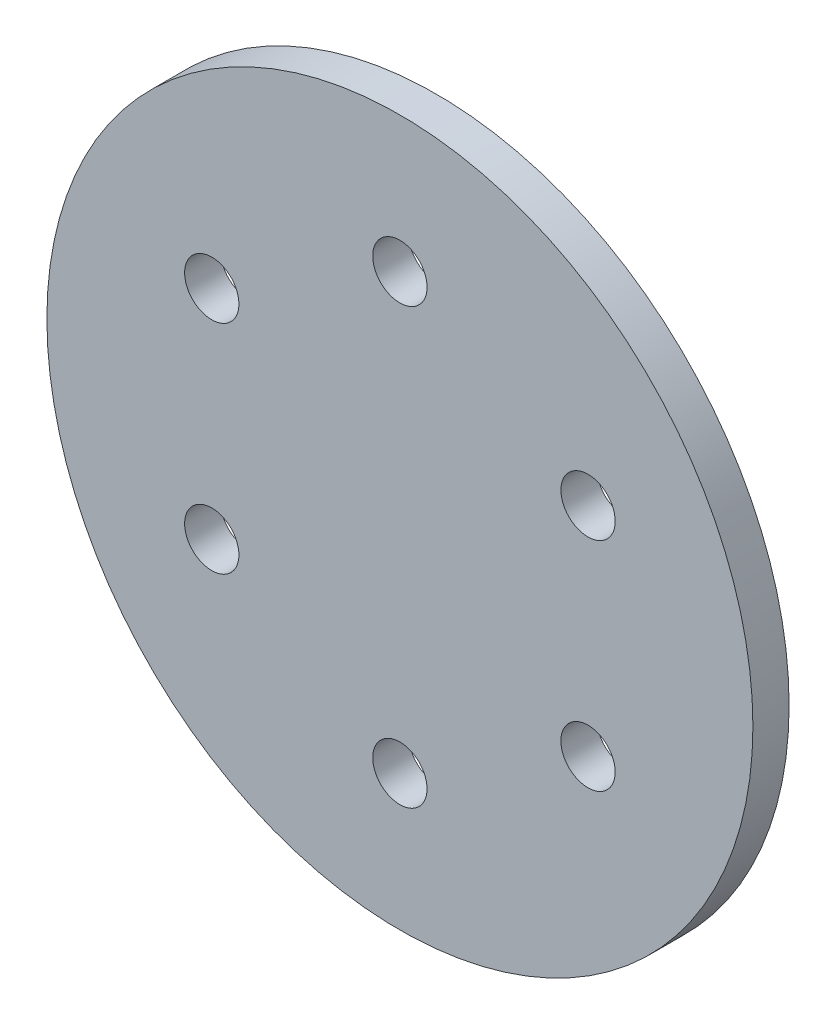
ISO-10303-21;
HEADER;
FILE_DESCRIPTION(('STEP AP214'),'2;1');
FILE_NAME('part.step','',(''),(''),'','','');
FILE_SCHEMA(('AUTOMOTIVE_DESIGN { 1 0 10303 214 1 1 1 1 }'));
ENDSEC;
DATA;
#1=APPLICATION_CONTEXT('core data for automotive mechanical design processes');
#2=APPLICATION_PROTOCOL_DEFINITION('international standard','automotive_design',2000,#1);
#3=PRODUCT_CONTEXT('',#1,'mechanical');
#4=PRODUCT('Part','Part','',(#3));
#5=PRODUCT_RELATED_PRODUCT_CATEGORY('part','',(#4));
#6=PRODUCT_DEFINITION_FORMATION('','',#4);
#7=PRODUCT_DEFINITION_CONTEXT('part definition',#1,'design');
#8=PRODUCT_DEFINITION('design','',#6,#7);
#9=PRODUCT_DEFINITION_SHAPE('','',#8);
#10=(LENGTH_UNIT() NAMED_UNIT(*) SI_UNIT(.MILLI.,.METRE.));
#11=(NAMED_UNIT(*) PLANE_ANGLE_UNIT() SI_UNIT($,.RADIAN.));
#12=(NAMED_UNIT(*) SI_UNIT($,.STERADIAN.) SOLID_ANGLE_UNIT());
#13=UNCERTAINTY_MEASURE_WITH_UNIT(LENGTH_MEASURE(1.E-05),#10,'distance_accuracy_value','');
#14=(GEOMETRIC_REPRESENTATION_CONTEXT(3) GLOBAL_UNCERTAINTY_ASSIGNED_CONTEXT((#13)) GLOBAL_UNIT_ASSIGNED_CONTEXT((#10,
#11,#12)) REPRESENTATION_CONTEXT('',''));
#15=CARTESIAN_POINT('',(0.,0.,0.));
#16=DIRECTION('',(0.,0.,1.));
#17=DIRECTION('',(1.,0.,0.));
#18=AXIS2_PLACEMENT_3D('',#15,#16,#17);
#19=CARTESIAN_POINT('',(0.,0.,3.175));
#20=DIRECTION('',(0.,0.,1.));
#21=DIRECTION('',(1.,0.,0.));
#22=AXIS2_PLACEMENT_3D('',#19,#20,#21);
#23=PLANE('',#22);
#24=CARTESIAN_POINT('',(-16.4977839420919,-9.52500000000094,3.175));
#25=DIRECTION('',(0.,0.,1.));
#26=DIRECTION('',(1.,0.,0.));
#27=AXIS2_PLACEMENT_3D('',#24,#25,#26);
#28=CIRCLE('',#27,2.381250000002);
#29=CARTESIAN_POINT('',(-14.1165339420899,-9.52500000000094,3.175));
#30=VERTEX_POINT('',#29);
#31=EDGE_CURVE('E65',#30,#30,#28,.T.);
#32=ORIENTED_EDGE('',*,*,#31,.F.);
#33=EDGE_LOOP('',(#32));
#34=FACE_BOUND('',#33,.T.);
#35=CARTESIAN_POINT('',(16.4977839420952,-9.52499999999906,3.175));
#36=DIRECTION('',(0.,0.,1.));
#37=DIRECTION('',(1.,0.,0.));
#38=AXIS2_PLACEMENT_3D('',#35,#36,#37);
#39=CIRCLE('',#38,2.38125000000136);
#40=CARTESIAN_POINT('',(18.8790339420965,-9.52499999999906,3.175));
#41=VERTEX_POINT('',#40);
#42=EDGE_CURVE('E53',#41,#41,#39,.T.);
#43=ORIENTED_EDGE('',*,*,#42,.F.);
#44=EDGE_LOOP('',(#43));
#45=FACE_BOUND('',#44,.T.);
#46=CARTESIAN_POINT('',(0.,19.05,3.175));
#47=DIRECTION('',(0.,0.,1.));
#48=DIRECTION('',(1.,0.,0.));
#49=AXIS2_PLACEMENT_3D('',#46,#47,#48);
#50=CIRCLE('',#49,2.38125);
#51=CARTESIAN_POINT('',(2.38125,19.05,3.175));
#52=VERTEX_POINT('',#51);
#53=EDGE_CURVE('E42',#52,#52,#50,.T.);
#54=ORIENTED_EDGE('',*,*,#53,.F.);
#55=EDGE_LOOP('',(#54));
#56=FACE_BOUND('',#55,.T.);
#57=CARTESIAN_POINT('',(0.,0.,3.175));
#58=DIRECTION('',(0.,0.,1.));
#59=DIRECTION('',(1.,0.,0.));
#60=AXIS2_PLACEMENT_3D('',#57,#58,#59);
#61=CIRCLE('',#60,30.95625);
#62=CARTESIAN_POINT('',(30.95625,0.,3.175));
#63=VERTEX_POINT('',#62);
#64=EDGE_CURVE('E10',#63,#63,#61,.T.);
#65=ORIENTED_EDGE('',*,*,#64,.T.);
#66=EDGE_LOOP('',(#65));
#67=FACE_BOUND('',#66,.T.);
#68=CARTESIAN_POINT('',(16.4977839420941,9.52500000000094,3.175));
#69=DIRECTION('',(0.,0.,1.));
#70=DIRECTION('',(1.,0.,0.));
#71=AXIS2_PLACEMENT_3D('',#68,#69,#70);
#72=CIRCLE('',#71,2.38125000000029);
#73=CARTESIAN_POINT('',(18.8790339420944,9.52500000000094,3.175));
#74=VERTEX_POINT('',#73);
#75=EDGE_CURVE('E47',#74,#74,#72,.T.);
#76=ORIENTED_EDGE('',*,*,#75,.F.);
#77=EDGE_LOOP('',(#76));
#78=FACE_BOUND('',#77,.T.);
#79=CARTESIAN_POINT('',(2.16106835429203E-12,-19.05,3.175));
#80=DIRECTION('',(0.,0.,1.));
#81=DIRECTION('',(1.,0.,0.));
#82=AXIS2_PLACEMENT_3D('',#79,#80,#81);
#83=CIRCLE('',#82,2.38125000000219);
#84=CARTESIAN_POINT('',(2.38125000000436,-19.05,3.175));
#85=VERTEX_POINT('',#84);
#86=EDGE_CURVE('E59',#85,#85,#83,.T.);
#87=ORIENTED_EDGE('',*,*,#86,.F.);
#88=EDGE_LOOP('',(#87));
#89=FACE_BOUND('',#88,.T.);
#90=CARTESIAN_POINT('',(-16.497783942093,9.52499999999905,3.175));
#91=DIRECTION('',(0.,0.,1.));
#92=DIRECTION('',(1.,0.,0.));
#93=AXIS2_PLACEMENT_3D('',#90,#91,#92);
#94=CIRCLE('',#93,2.38125000000102);
#95=CARTESIAN_POINT('',(-14.116533942092,9.52499999999905,3.175));
#96=VERTEX_POINT('',#95);
#97=EDGE_CURVE('E71',#96,#96,#94,.T.);
#98=ORIENTED_EDGE('',*,*,#97,.F.);
#99=EDGE_LOOP('',(#98));
#100=FACE_BOUND('',#99,.T.);
#101=ADVANCED_FACE('F31',(#34,#45,#56,#67,#78,#89,#100),#23,.T.);
#102=CARTESIAN_POINT('',(0.,0.,0.));
#103=DIRECTION('',(0.,0.,1.));
#104=DIRECTION('',(1.,0.,0.));
#105=AXIS2_PLACEMENT_3D('',#102,#103,#104);
#106=PLANE('',#105);
#107=CARTESIAN_POINT('',(0.,0.,0.));
#108=DIRECTION('',(0.,0.,1.));
#109=DIRECTION('',(1.,0.,0.));
#110=AXIS2_PLACEMENT_3D('',#107,#108,#109);
#111=CIRCLE('',#110,30.95625);
#112=CARTESIAN_POINT('',(30.95625,0.,0.));
#113=VERTEX_POINT('',#112);
#114=EDGE_CURVE('E35',#113,#113,#111,.T.);
#115=ORIENTED_EDGE('',*,*,#114,.F.);
#116=EDGE_LOOP('',(#115));
#117=FACE_BOUND('',#116,.T.);
#118=CARTESIAN_POINT('',(0.,19.05,0.));
#119=DIRECTION('',(0.,0.,1.));
#120=DIRECTION('',(1.,0.,0.));
#121=AXIS2_PLACEMENT_3D('',#118,#119,#120);
#122=CIRCLE('',#121,2.38125);
#123=CARTESIAN_POINT('',(2.38125,19.05,0.));
#124=VERTEX_POINT('',#123);
#125=EDGE_CURVE('E44',#124,#124,#122,.T.);
#126=ORIENTED_EDGE('',*,*,#125,.T.);
#127=EDGE_LOOP('',(#126));
#128=FACE_BOUND('',#127,.T.);
#129=CARTESIAN_POINT('',(16.4977839420941,9.52500000000094,0.));
#130=DIRECTION('',(0.,0.,1.));
#131=DIRECTION('',(1.,0.,0.));
#132=AXIS2_PLACEMENT_3D('',#129,#130,#131);
#133=CIRCLE('',#132,2.38125000000029);
#134=CARTESIAN_POINT('',(18.8790339420944,9.52500000000094,0.));
#135=VERTEX_POINT('',#134);
#136=EDGE_CURVE('E50',#135,#135,#133,.T.);
#137=ORIENTED_EDGE('',*,*,#136,.T.);
#138=EDGE_LOOP('',(#137));
#139=FACE_BOUND('',#138,.T.);
#140=CARTESIAN_POINT('',(16.4977839420952,-9.52499999999906,0.));
#141=DIRECTION('',(0.,0.,1.));
#142=DIRECTION('',(1.,0.,0.));
#143=AXIS2_PLACEMENT_3D('',#140,#141,#142);
#144=CIRCLE('',#143,2.38125000000136);
#145=CARTESIAN_POINT('',(18.8790339420965,-9.52499999999906,0.));
#146=VERTEX_POINT('',#145);
#147=EDGE_CURVE('E56',#146,#146,#144,.T.);
#148=ORIENTED_EDGE('',*,*,#147,.T.);
#149=EDGE_LOOP('',(#148));
#150=FACE_BOUND('',#149,.T.);
#151=CARTESIAN_POINT('',(2.16106835429203E-12,-19.05,0.));
#152=DIRECTION('',(0.,0.,1.));
#153=DIRECTION('',(1.,0.,0.));
#154=AXIS2_PLACEMENT_3D('',#151,#152,#153);
#155=CIRCLE('',#154,2.38125000000219);
#156=CARTESIAN_POINT('',(2.38125000000436,-19.05,0.));
#157=VERTEX_POINT('',#156);
#158=EDGE_CURVE('E62',#157,#157,#155,.T.);
#159=ORIENTED_EDGE('',*,*,#158,.T.);
#160=EDGE_LOOP('',(#159));
#161=FACE_BOUND('',#160,.T.);
#162=CARTESIAN_POINT('',(-16.4977839420919,-9.52500000000094,0.));
#163=DIRECTION('',(0.,0.,1.));
#164=DIRECTION('',(1.,0.,0.));
#165=AXIS2_PLACEMENT_3D('',#162,#163,#164);
#166=CIRCLE('',#165,2.381250000002);
#167=CARTESIAN_POINT('',(-14.1165339420899,-9.52500000000094,0.));
#168=VERTEX_POINT('',#167);
#169=EDGE_CURVE('E68',#168,#168,#166,.T.);
#170=ORIENTED_EDGE('',*,*,#169,.T.);
#171=EDGE_LOOP('',(#170));
#172=FACE_BOUND('',#171,.T.);
#173=CARTESIAN_POINT('',(-16.497783942093,9.52499999999905,0.));
#174=DIRECTION('',(0.,0.,1.));
#175=DIRECTION('',(1.,0.,0.));
#176=AXIS2_PLACEMENT_3D('',#173,#174,#175);
#177=CIRCLE('',#176,2.38125000000102);
#178=CARTESIAN_POINT('',(-14.116533942092,9.52499999999905,0.));
#179=VERTEX_POINT('',#178);
#180=EDGE_CURVE('E74',#179,#179,#177,.T.);
#181=ORIENTED_EDGE('',*,*,#180,.T.);
#182=EDGE_LOOP('',(#181));
#183=FACE_BOUND('',#182,.T.);
#184=ADVANCED_FACE('F84',(#117,#128,#139,#150,#161,#172,#183),#106,.F.);
#185=CARTESIAN_POINT('',(0.,0.,3.175));
#186=DIRECTION('',(0.,0.,-1.));
#187=DIRECTION('',(-1.,0.,0.));
#188=AXIS2_PLACEMENT_3D('',#185,#186,#187);
#189=CYLINDRICAL_SURFACE('',#188,30.95625);
#190=ORIENTED_EDGE('',*,*,#64,.F.);
#191=EDGE_LOOP('',(#190));
#192=FACE_BOUND('',#191,.T.);
#193=ORIENTED_EDGE('',*,*,#114,.T.);
#194=EDGE_LOOP('',(#193));
#195=FACE_BOUND('',#194,.T.);
#196=ADVANCED_FACE('F33',(#192,#195),#189,.T.);
#197=CARTESIAN_POINT('',(0.,19.05,3.175));
#198=DIRECTION('',(0.,0.,-1.));
#199=DIRECTION('',(-1.,0.,0.));
#200=AXIS2_PLACEMENT_3D('',#197,#198,#199);
#201=CYLINDRICAL_SURFACE('',#200,2.38125);
#202=ORIENTED_EDGE('',*,*,#53,.T.);
#203=EDGE_LOOP('',(#202));
#204=FACE_BOUND('',#203,.T.);
#205=ORIENTED_EDGE('',*,*,#125,.F.);
#206=EDGE_LOOP('',(#205));
#207=FACE_BOUND('',#206,.T.);
#208=ADVANCED_FACE('F94',(#204,#207),#201,.F.);
#209=CARTESIAN_POINT('',(16.4977839420941,9.52500000000094,3.175));
#210=DIRECTION('',(0.,0.,-1.));
#211=DIRECTION('',(-1.,0.,0.));
#212=AXIS2_PLACEMENT_3D('',#209,#210,#211);
#213=CYLINDRICAL_SURFACE('',#212,2.38125000000029);
#214=ORIENTED_EDGE('',*,*,#75,.T.);
#215=EDGE_LOOP('',(#214));
#216=FACE_BOUND('',#215,.T.);
#217=ORIENTED_EDGE('',*,*,#136,.F.);
#218=EDGE_LOOP('',(#217));
#219=FACE_BOUND('',#218,.T.);
#220=ADVANCED_FACE('F97',(#216,#219),#213,.F.);
#221=CARTESIAN_POINT('',(16.4977839420952,-9.52499999999906,3.175));
#222=DIRECTION('',(0.,0.,-1.));
#223=DIRECTION('',(-1.,0.,0.));
#224=AXIS2_PLACEMENT_3D('',#221,#222,#223);
#225=CYLINDRICAL_SURFACE('',#224,2.38125000000136);
#226=ORIENTED_EDGE('',*,*,#42,.T.);
#227=EDGE_LOOP('',(#226));
#228=FACE_BOUND('',#227,.T.);
#229=ORIENTED_EDGE('',*,*,#147,.F.);
#230=EDGE_LOOP('',(#229));
#231=FACE_BOUND('',#230,.T.);
#232=ADVANCED_FACE('F101',(#228,#231),#225,.F.);
#233=CARTESIAN_POINT('',(2.16106835429203E-12,-19.05,3.175));
#234=DIRECTION('',(0.,0.,-1.));
#235=DIRECTION('',(-1.,0.,0.));
#236=AXIS2_PLACEMENT_3D('',#233,#234,#235);
#237=CYLINDRICAL_SURFACE('',#236,2.38125000000219);
#238=ORIENTED_EDGE('',*,*,#86,.T.);
#239=EDGE_LOOP('',(#238));
#240=FACE_BOUND('',#239,.T.);
#241=ORIENTED_EDGE('',*,*,#158,.F.);
#242=EDGE_LOOP('',(#241));
#243=FACE_BOUND('',#242,.T.);
#244=ADVANCED_FACE('F105',(#240,#243),#237,.F.);
#245=CARTESIAN_POINT('',(-16.4977839420919,-9.52500000000094,3.175));
#246=DIRECTION('',(0.,0.,-1.));
#247=DIRECTION('',(-1.,0.,0.));
#248=AXIS2_PLACEMENT_3D('',#245,#246,#247);
#249=CYLINDRICAL_SURFACE('',#248,2.381250000002);
#250=ORIENTED_EDGE('',*,*,#31,.T.);
#251=EDGE_LOOP('',(#250));
#252=FACE_BOUND('',#251,.T.);
#253=ORIENTED_EDGE('',*,*,#169,.F.);
#254=EDGE_LOOP('',(#253));
#255=FACE_BOUND('',#254,.T.);
#256=ADVANCED_FACE('F109',(#252,#255),#249,.F.);
#257=CARTESIAN_POINT('',(-16.497783942093,9.52499999999905,3.175));
#258=DIRECTION('',(0.,0.,-1.));
#259=DIRECTION('',(-1.,0.,0.));
#260=AXIS2_PLACEMENT_3D('',#257,#258,#259);
#261=CYLINDRICAL_SURFACE('',#260,2.38125000000102);
#262=ORIENTED_EDGE('',*,*,#97,.T.);
#263=EDGE_LOOP('',(#262));
#264=FACE_BOUND('',#263,.T.);
#265=ORIENTED_EDGE('',*,*,#180,.F.);
#266=EDGE_LOOP('',(#265));
#267=FACE_BOUND('',#266,.T.);
#268=ADVANCED_FACE('F80',(#264,#267),#261,.F.);
#269=CLOSED_SHELL('',(#101,#184,#196,#208,#220,#232,#244,#256,#268));
#270=MANIFOLD_SOLID_BREP('B2',#269);
#271=ADVANCED_BREP_SHAPE_REPRESENTATION('',(#18,#270),#14);
#272=SHAPE_DEFINITION_REPRESENTATION(#9,#271);
ENDSEC;
END-ISO-10303-21;
